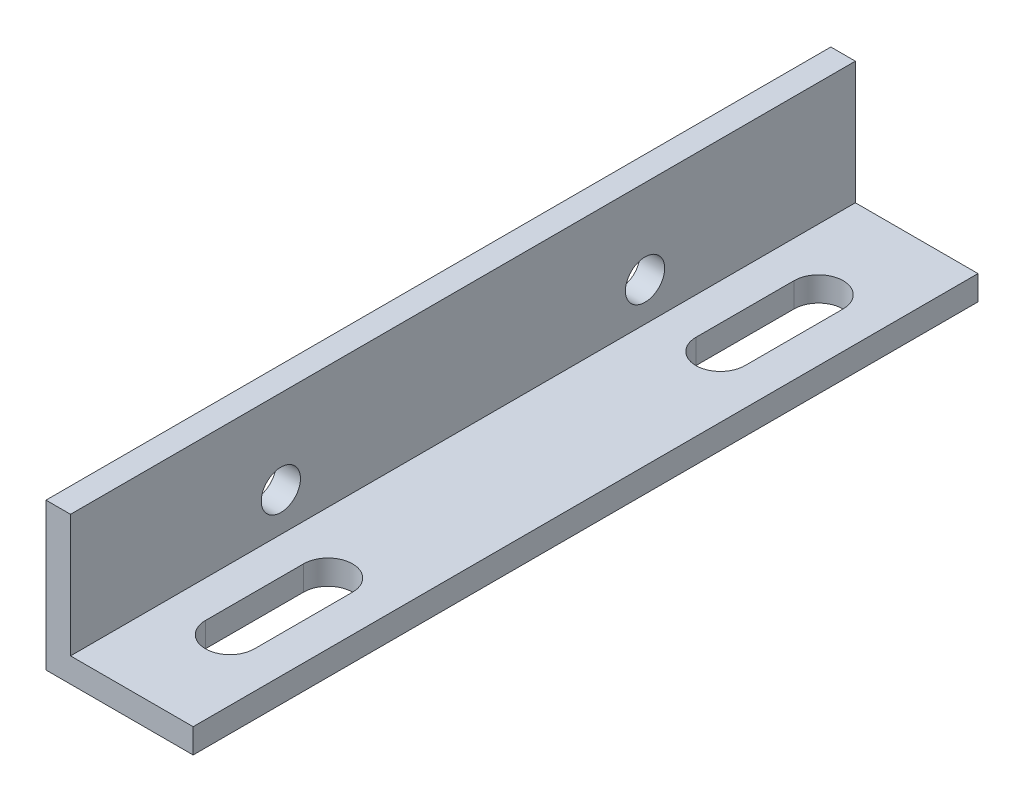
ISO-10303-21;
HEADER;
FILE_DESCRIPTION(('STEP AP214'),'2;1');
FILE_NAME('part.step','',(''),(''),'','','');
FILE_SCHEMA(('AUTOMOTIVE_DESIGN { 1 0 10303 214 1 1 1 1 }'));
ENDSEC;
DATA;
#1=APPLICATION_CONTEXT('core data for automotive mechanical design processes');
#2=APPLICATION_PROTOCOL_DEFINITION('international standard','automotive_design',2000,#1);
#3=PRODUCT_CONTEXT('',#1,'mechanical');
#4=PRODUCT('Part','Part','',(#3));
#5=PRODUCT_RELATED_PRODUCT_CATEGORY('part','',(#4));
#6=PRODUCT_DEFINITION_FORMATION('','',#4);
#7=PRODUCT_DEFINITION_CONTEXT('part definition',#1,'design');
#8=PRODUCT_DEFINITION('design','',#6,#7);
#9=PRODUCT_DEFINITION_SHAPE('','',#8);
#10=(LENGTH_UNIT() NAMED_UNIT(*) SI_UNIT(.MILLI.,.METRE.));
#11=(NAMED_UNIT(*) PLANE_ANGLE_UNIT() SI_UNIT($,.RADIAN.));
#12=(NAMED_UNIT(*) SI_UNIT($,.STERADIAN.) SOLID_ANGLE_UNIT());
#13=UNCERTAINTY_MEASURE_WITH_UNIT(LENGTH_MEASURE(1.E-05),#10,'distance_accuracy_value','');
#14=(GEOMETRIC_REPRESENTATION_CONTEXT(3) GLOBAL_UNCERTAINTY_ASSIGNED_CONTEXT((#13)) GLOBAL_UNIT_ASSIGNED_CONTEXT((#10,
#11,#12)) REPRESENTATION_CONTEXT('',''));
#15=CARTESIAN_POINT('',(0.,0.,0.));
#16=DIRECTION('',(0.,0.,1.));
#17=DIRECTION('',(1.,0.,0.));
#18=AXIS2_PLACEMENT_3D('',#15,#16,#17);
#19=CARTESIAN_POINT('',(24.638,31.75,53.9466685319904));
#20=DIRECTION('',(0.,-1.,0.));
#21=DIRECTION('',(0.,0.,-1.));
#22=AXIS2_PLACEMENT_3D('',#19,#20,#21);
#23=PLANE('',#22);
#24=DIRECTION('',(-1.,0.,0.));
#25=VECTOR('',#24,1.);
#26=CARTESIAN_POINT('',(24.638,31.75,-47.6533314680096));
#27=LINE('',#26,#25);
#28=CARTESIAN_POINT('',(24.638,31.75,-47.6533314680096));
#29=VERTEX_POINT('',#28);
#30=CARTESIAN_POINT('',(21.463,31.75,-47.6533314680096));
#31=VERTEX_POINT('',#30);
#32=EDGE_CURVE('E197',#29,#31,#27,.T.);
#33=ORIENTED_EDGE('',*,*,#32,.T.);
#34=DIRECTION('',(0.,0.,-1.));
#35=VECTOR('',#34,1.);
#36=CARTESIAN_POINT('',(21.463,31.75,53.9466685319904));
#37=LINE('',#36,#35);
#38=CARTESIAN_POINT('',(21.463,31.75,53.9466685319904));
#39=VERTEX_POINT('',#38);
#40=EDGE_CURVE('E11',#39,#31,#37,.T.);
#41=ORIENTED_EDGE('',*,*,#40,.F.);
#42=DIRECTION('',(-1.,0.,0.));
#43=VECTOR('',#42,1.);
#44=CARTESIAN_POINT('',(24.638,31.75,53.9466685319904));
#45=LINE('',#44,#43);
#46=CARTESIAN_POINT('',(24.638,31.75,53.9466685319904));
#47=VERTEX_POINT('',#46);
#48=EDGE_CURVE('E204',#47,#39,#45,.T.);
#49=ORIENTED_EDGE('',*,*,#48,.F.);
#50=DIRECTION('',(0.,0.,-1.));
#51=VECTOR('',#50,1.);
#52=CARTESIAN_POINT('',(24.638,31.75,53.9466685319904));
#53=LINE('',#52,#51);
#54=EDGE_CURVE('E218',#47,#29,#53,.T.);
#55=ORIENTED_EDGE('',*,*,#54,.T.);
#56=EDGE_LOOP('',(#33,#41,#49,#55));
#57=FACE_BOUND('',#56,.T.);
#58=ADVANCED_FACE('F31',(#57),#23,.F.);
#59=CARTESIAN_POINT('',(21.463,31.75,53.9466685319904));
#60=DIRECTION('',(1.,0.,0.));
#61=DIRECTION('',(0.,1.,0.));
#62=AXIS2_PLACEMENT_3D('',#59,#60,#61);
#63=PLANE('',#62);
#64=CARTESIAN_POINT('',(21.463,20.8788,26.7178685319904));
#65=DIRECTION('',(1.,0.,0.));
#66=DIRECTION('',(0.,0.,-1.));
#67=AXIS2_PLACEMENT_3D('',#64,#65,#66);
#68=CIRCLE('',#67,2.54);
#69=CARTESIAN_POINT('',(21.463,20.8788,24.1778685319904));
#70=VERTEX_POINT('',#69);
#71=EDGE_CURVE('E430',#70,#70,#68,.T.);
#72=ORIENTED_EDGE('',*,*,#71,.T.);
#73=EDGE_LOOP('',(#72));
#74=FACE_BOUND('',#73,.T.);
#75=CARTESIAN_POINT('',(21.463,20.8788,-20.4245314680097));
#76=DIRECTION('',(1.,0.,0.));
#77=DIRECTION('',(0.,0.,-1.));
#78=AXIS2_PLACEMENT_3D('',#75,#76,#77);
#79=CIRCLE('',#78,2.54);
#80=CARTESIAN_POINT('',(21.463,20.8788,-22.9645314680097));
#81=VERTEX_POINT('',#80);
#82=EDGE_CURVE('E162',#81,#81,#79,.T.);
#83=ORIENTED_EDGE('',*,*,#82,.T.);
#84=EDGE_LOOP('',(#83));
#85=FACE_BOUND('',#84,.T.);
#86=DIRECTION('',(0.,-1.,0.));
#87=VECTOR('',#86,1.);
#88=CARTESIAN_POINT('',(21.463,31.75,-47.6533314680096));
#89=LINE('',#88,#87);
#90=CARTESIAN_POINT('',(21.463,12.7,-47.6533314680096));
#91=VERTEX_POINT('',#90);
#92=EDGE_CURVE('E221',#31,#91,#89,.T.);
#93=ORIENTED_EDGE('',*,*,#92,.T.);
#94=DIRECTION('',(0.,0.,-1.));
#95=VECTOR('',#94,1.);
#96=CARTESIAN_POINT('',(21.463,12.7,53.9466685319904));
#97=LINE('',#96,#95);
#98=CARTESIAN_POINT('',(21.463,12.7,53.9466685319904));
#99=VERTEX_POINT('',#98);
#100=EDGE_CURVE('E38',#99,#91,#97,.T.);
#101=ORIENTED_EDGE('',*,*,#100,.F.);
#102=DIRECTION('',(0.,-1.,0.));
#103=VECTOR('',#102,1.);
#104=CARTESIAN_POINT('',(21.463,31.75,53.9466685319904));
#105=LINE('',#104,#103);
#106=EDGE_CURVE('E207',#39,#99,#105,.T.);
#107=ORIENTED_EDGE('',*,*,#106,.F.);
#108=ORIENTED_EDGE('',*,*,#40,.T.);
#109=EDGE_LOOP('',(#93,#101,#107,#108));
#110=FACE_BOUND('',#109,.T.);
#111=ADVANCED_FACE('F267',(#74,#85,#110),#63,.F.);
#112=CARTESIAN_POINT('',(21.463,12.7,53.9466685319904));
#113=DIRECTION('',(0.,1.,0.));
#114=DIRECTION('',(-1.,0.,0.));
#115=AXIS2_PLACEMENT_3D('',#112,#113,#114);
#116=PLANE('',#115);
#117=DIRECTION('',(0.,0.,-1.));
#118=VECTOR('',#117,1.);
#119=CARTESIAN_POINT('',(35.7505,12.7,-34.9533314680097));
#120=LINE('',#119,#118);
#121=CARTESIAN_POINT('',(35.7505,12.7,-22.2533314680096));
#122=VERTEX_POINT('',#121);
#123=CARTESIAN_POINT('',(35.7505,12.7,-34.9533314680097));
#124=VERTEX_POINT('',#123);
#125=EDGE_CURVE('E139',#122,#124,#120,.T.);
#126=ORIENTED_EDGE('',*,*,#125,.T.);
#127=CARTESIAN_POINT('',(32.5755,12.7,-34.9533314680097));
#128=DIRECTION('',(0.,1.,0.));
#129=DIRECTION('',(0.,0.,1.));
#130=AXIS2_PLACEMENT_3D('',#127,#128,#129);
#131=CIRCLE('',#130,3.175);
#132=CARTESIAN_POINT('',(29.4005,12.7,-34.9533314680097));
#133=VERTEX_POINT('',#132);
#134=EDGE_CURVE('E133',#124,#133,#131,.T.);
#135=ORIENTED_EDGE('',*,*,#134,.T.);
#136=DIRECTION('',(0.,0.,1.));
#137=VECTOR('',#136,1.);
#138=CARTESIAN_POINT('',(29.4005,12.7,-34.9533314680097));
#139=LINE('',#138,#137);
#140=CARTESIAN_POINT('',(29.4005,12.7,-22.2533314680096));
#141=VERTEX_POINT('',#140);
#142=EDGE_CURVE('E142',#133,#141,#139,.T.);
#143=ORIENTED_EDGE('',*,*,#142,.T.);
#144=CARTESIAN_POINT('',(32.5755,12.7,-22.2533314680096));
#145=DIRECTION('',(0.,1.,0.));
#146=DIRECTION('',(0.,0.,1.));
#147=AXIS2_PLACEMENT_3D('',#144,#145,#146);
#148=CIRCLE('',#147,3.175);
#149=EDGE_CURVE('E45',#141,#122,#148,.T.);
#150=ORIENTED_EDGE('',*,*,#149,.T.);
#151=EDGE_LOOP('',(#126,#135,#143,#150));
#152=FACE_BOUND('',#151,.T.);
#153=DIRECTION('',(0.,0.,-1.));
#154=VECTOR('',#153,1.);
#155=CARTESIAN_POINT('',(35.7505,12.7,41.2466685319904));
#156=LINE('',#155,#154);
#157=CARTESIAN_POINT('',(35.7505,12.7,41.2466685319904));
#158=VERTEX_POINT('',#157);
#159=CARTESIAN_POINT('',(35.7505,12.7,28.5466685319904));
#160=VERTEX_POINT('',#159);
#161=EDGE_CURVE('E182',#158,#160,#156,.T.);
#162=ORIENTED_EDGE('',*,*,#161,.T.);
#163=CARTESIAN_POINT('',(32.5755,12.7,28.5466685319904));
#164=DIRECTION('',(0.,1.,0.));
#165=DIRECTION('',(0.,0.,-1.));
#166=AXIS2_PLACEMENT_3D('',#163,#164,#165);
#167=CIRCLE('',#166,3.175);
#168=CARTESIAN_POINT('',(29.4005,12.7,28.5466685319904));
#169=VERTEX_POINT('',#168);
#170=EDGE_CURVE('E172',#160,#169,#167,.T.);
#171=ORIENTED_EDGE('',*,*,#170,.T.);
#172=DIRECTION('',(0.,0.,1.));
#173=VECTOR('',#172,1.);
#174=CARTESIAN_POINT('',(29.4005,12.7,41.2466685319904));
#175=LINE('',#174,#173);
#176=CARTESIAN_POINT('',(29.4005,12.7,41.2466685319904));
#177=VERTEX_POINT('',#176);
#178=EDGE_CURVE('E175',#169,#177,#175,.T.);
#179=ORIENTED_EDGE('',*,*,#178,.T.);
#180=CARTESIAN_POINT('',(32.5755,12.7,41.2466685319904));
#181=DIRECTION('',(0.,1.,0.));
#182=DIRECTION('',(0.,0.,-1.));
#183=AXIS2_PLACEMENT_3D('',#180,#181,#182);
#184=CIRCLE('',#183,3.175);
#185=EDGE_CURVE('E179',#177,#158,#184,.T.);
#186=ORIENTED_EDGE('',*,*,#185,.T.);
#187=EDGE_LOOP('',(#162,#171,#179,#186));
#188=FACE_BOUND('',#187,.T.);
#189=DIRECTION('',(1.,0.,0.));
#190=VECTOR('',#189,1.);
#191=CARTESIAN_POINT('',(21.463,12.7,-47.6533314680096));
#192=LINE('',#191,#190);
#193=CARTESIAN_POINT('',(40.513,12.7,-47.6533314680096));
#194=VERTEX_POINT('',#193);
#195=EDGE_CURVE('E223',#91,#194,#192,.T.);
#196=ORIENTED_EDGE('',*,*,#195,.T.);
#197=DIRECTION('',(0.,0.,-1.));
#198=VECTOR('',#197,1.);
#199=CARTESIAN_POINT('',(40.513,12.7,53.9466685319904));
#200=LINE('',#199,#198);
#201=CARTESIAN_POINT('',(40.513,12.7,53.9466685319904));
#202=VERTEX_POINT('',#201);
#203=EDGE_CURVE('E238',#202,#194,#200,.T.);
#204=ORIENTED_EDGE('',*,*,#203,.F.);
#205=DIRECTION('',(1.,0.,0.));
#206=VECTOR('',#205,1.);
#207=CARTESIAN_POINT('',(21.463,12.7,53.9466685319904));
#208=LINE('',#207,#206);
#209=EDGE_CURVE('E210',#99,#202,#208,.T.);
#210=ORIENTED_EDGE('',*,*,#209,.F.);
#211=ORIENTED_EDGE('',*,*,#100,.T.);
#212=EDGE_LOOP('',(#196,#204,#210,#211));
#213=FACE_BOUND('',#212,.T.);
#214=ADVANCED_FACE('F146',(#152,#188,#213),#116,.F.);
#215=CARTESIAN_POINT('',(40.513,12.7,53.9466685319904));
#216=DIRECTION('',(-1.,0.,0.));
#217=DIRECTION('',(0.,0.,1.));
#218=AXIS2_PLACEMENT_3D('',#215,#216,#217);
#219=PLANE('',#218);
#220=DIRECTION('',(0.,1.,0.));
#221=VECTOR('',#220,1.);
#222=CARTESIAN_POINT('',(40.513,12.7,-47.6533314680096));
#223=LINE('',#222,#221);
#224=CARTESIAN_POINT('',(40.513,15.875,-47.6533314680096));
#225=VERTEX_POINT('',#224);
#226=EDGE_CURVE('E225',#194,#225,#223,.T.);
#227=ORIENTED_EDGE('',*,*,#226,.T.);
#228=DIRECTION('',(0.,0.,-1.));
#229=VECTOR('',#228,1.);
#230=CARTESIAN_POINT('',(40.513,15.875,53.9466685319904));
#231=LINE('',#230,#229);
#232=CARTESIAN_POINT('',(40.513,15.875,53.9466685319904));
#233=VERTEX_POINT('',#232);
#234=EDGE_CURVE('E235',#233,#225,#231,.T.);
#235=ORIENTED_EDGE('',*,*,#234,.F.);
#236=DIRECTION('',(0.,1.,0.));
#237=VECTOR('',#236,1.);
#238=CARTESIAN_POINT('',(40.513,12.7,53.9466685319904));
#239=LINE('',#238,#237);
#240=EDGE_CURVE('E212',#202,#233,#239,.T.);
#241=ORIENTED_EDGE('',*,*,#240,.F.);
#242=ORIENTED_EDGE('',*,*,#203,.T.);
#243=EDGE_LOOP('',(#227,#235,#241,#242));
#244=FACE_BOUND('',#243,.T.);
#245=ADVANCED_FACE('F255',(#244),#219,.F.);
#246=CARTESIAN_POINT('',(40.513,15.875,53.9466685319904));
#247=DIRECTION('',(0.,-1.,0.));
#248=DIRECTION('',(1.,0.,0.));
#249=AXIS2_PLACEMENT_3D('',#246,#247,#248);
#250=PLANE('',#249);
#251=DIRECTION('',(0.,0.,1.));
#252=VECTOR('',#251,1.);
#253=CARTESIAN_POINT('',(29.4005,15.875,-34.9533314680097));
#254=LINE('',#253,#252);
#255=CARTESIAN_POINT('',(29.4005,15.875,-34.9533314680097));
#256=VERTEX_POINT('',#255);
#257=CARTESIAN_POINT('',(29.4005,15.875,-22.2533314680096));
#258=VERTEX_POINT('',#257);
#259=EDGE_CURVE('E161',#256,#258,#254,.T.);
#260=ORIENTED_EDGE('',*,*,#259,.F.);
#261=CARTESIAN_POINT('',(32.5755,15.875,-34.9533314680097));
#262=DIRECTION('',(0.,1.,0.));
#263=DIRECTION('',(0.,0.,1.));
#264=AXIS2_PLACEMENT_3D('',#261,#262,#263);
#265=CIRCLE('',#264,3.175);
#266=CARTESIAN_POINT('',(35.7505,15.875,-34.9533314680097));
#267=VERTEX_POINT('',#266);
#268=EDGE_CURVE('E53',#267,#256,#265,.T.);
#269=ORIENTED_EDGE('',*,*,#268,.F.);
#270=DIRECTION('',(0.,0.,-1.));
#271=VECTOR('',#270,1.);
#272=CARTESIAN_POINT('',(35.7505,15.875,-34.9533314680097));
#273=LINE('',#272,#271);
#274=CARTESIAN_POINT('',(35.7505,15.875,-22.2533314680096));
#275=VERTEX_POINT('',#274);
#276=EDGE_CURVE('E149',#275,#267,#273,.T.);
#277=ORIENTED_EDGE('',*,*,#276,.F.);
#278=CARTESIAN_POINT('',(32.5755,15.875,-22.2533314680096));
#279=DIRECTION('',(0.,1.,0.));
#280=DIRECTION('',(0.,0.,1.));
#281=AXIS2_PLACEMENT_3D('',#278,#279,#280);
#282=CIRCLE('',#281,3.175);
#283=EDGE_CURVE('E152',#258,#275,#282,.T.);
#284=ORIENTED_EDGE('',*,*,#283,.F.);
#285=EDGE_LOOP('',(#260,#269,#277,#284));
#286=FACE_BOUND('',#285,.T.);
#287=DIRECTION('',(0.,0.,1.));
#288=VECTOR('',#287,1.);
#289=CARTESIAN_POINT('',(29.4005,15.875,41.2466685319904));
#290=LINE('',#289,#288);
#291=CARTESIAN_POINT('',(29.4005,15.875,28.5466685319904));
#292=VERTEX_POINT('',#291);
#293=CARTESIAN_POINT('',(29.4005,15.875,41.2466685319904));
#294=VERTEX_POINT('',#293);
#295=EDGE_CURVE('E187',#292,#294,#290,.T.);
#296=ORIENTED_EDGE('',*,*,#295,.F.);
#297=CARTESIAN_POINT('',(32.5755,15.875,28.5466685319904));
#298=DIRECTION('',(0.,1.,0.));
#299=DIRECTION('',(0.,0.,-1.));
#300=AXIS2_PLACEMENT_3D('',#297,#298,#299);
#301=CIRCLE('',#300,3.175);
#302=CARTESIAN_POINT('',(35.7505,15.875,28.5466685319904));
#303=VERTEX_POINT('',#302);
#304=EDGE_CURVE('E168',#303,#292,#301,.T.);
#305=ORIENTED_EDGE('',*,*,#304,.F.);
#306=DIRECTION('',(0.,0.,-1.));
#307=VECTOR('',#306,1.);
#308=CARTESIAN_POINT('',(35.7505,15.875,41.2466685319904));
#309=LINE('',#308,#307);
#310=CARTESIAN_POINT('',(35.7505,15.875,41.2466685319904));
#311=VERTEX_POINT('',#310);
#312=EDGE_CURVE('E176',#311,#303,#309,.T.);
#313=ORIENTED_EDGE('',*,*,#312,.F.);
#314=CARTESIAN_POINT('',(32.5755,15.875,41.2466685319904));
#315=DIRECTION('',(0.,1.,0.));
#316=DIRECTION('',(0.,0.,-1.));
#317=AXIS2_PLACEMENT_3D('',#314,#315,#316);
#318=CIRCLE('',#317,3.175);
#319=EDGE_CURVE('E190',#294,#311,#318,.T.);
#320=ORIENTED_EDGE('',*,*,#319,.F.);
#321=EDGE_LOOP('',(#296,#305,#313,#320));
#322=FACE_BOUND('',#321,.T.);
#323=DIRECTION('',(-1.,0.,0.));
#324=VECTOR('',#323,1.);
#325=CARTESIAN_POINT('',(40.513,15.875,-47.6533314680096));
#326=LINE('',#325,#324);
#327=CARTESIAN_POINT('',(24.638,15.875,-47.6533314680096));
#328=VERTEX_POINT('',#327);
#329=EDGE_CURVE('E227',#225,#328,#326,.T.);
#330=ORIENTED_EDGE('',*,*,#329,.T.);
#331=DIRECTION('',(0.,0.,-1.));
#332=VECTOR('',#331,1.);
#333=CARTESIAN_POINT('',(24.638,15.875,53.9466685319904));
#334=LINE('',#333,#332);
#335=CARTESIAN_POINT('',(24.638,15.875,53.9466685319904));
#336=VERTEX_POINT('',#335);
#337=EDGE_CURVE('E232',#336,#328,#334,.T.);
#338=ORIENTED_EDGE('',*,*,#337,.F.);
#339=DIRECTION('',(-1.,0.,0.));
#340=VECTOR('',#339,1.);
#341=CARTESIAN_POINT('',(40.513,15.875,53.9466685319904));
#342=LINE('',#341,#340);
#343=EDGE_CURVE('E214',#233,#336,#342,.T.);
#344=ORIENTED_EDGE('',*,*,#343,.F.);
#345=ORIENTED_EDGE('',*,*,#234,.T.);
#346=EDGE_LOOP('',(#330,#338,#344,#345));
#347=FACE_BOUND('',#346,.T.);
#348=ADVANCED_FACE('F259',(#286,#322,#347),#250,.F.);
#349=CARTESIAN_POINT('',(24.638,15.875,53.9466685319904));
#350=DIRECTION('',(-1.,0.,0.));
#351=DIRECTION('',(0.,-1.,0.));
#352=AXIS2_PLACEMENT_3D('',#349,#350,#351);
#353=PLANE('',#352);
#354=CARTESIAN_POINT('',(24.638,20.8788,26.7178685319904));
#355=DIRECTION('',(1.,0.,0.));
#356=DIRECTION('',(0.,0.,-1.));
#357=AXIS2_PLACEMENT_3D('',#354,#355,#356);
#358=CIRCLE('',#357,2.54);
#359=CARTESIAN_POINT('',(24.638,20.8788,24.1778685319904));
#360=VERTEX_POINT('',#359);
#361=EDGE_CURVE('E432',#360,#360,#358,.T.);
#362=ORIENTED_EDGE('',*,*,#361,.F.);
#363=EDGE_LOOP('',(#362));
#364=FACE_BOUND('',#363,.T.);
#365=CARTESIAN_POINT('',(24.638,20.8788,-20.4245314680097));
#366=DIRECTION('',(1.,0.,0.));
#367=DIRECTION('',(0.,0.,-1.));
#368=AXIS2_PLACEMENT_3D('',#365,#366,#367);
#369=CIRCLE('',#368,2.54);
#370=CARTESIAN_POINT('',(24.638,20.8788,-22.9645314680097));
#371=VERTEX_POINT('',#370);
#372=EDGE_CURVE('E155',#371,#371,#369,.T.);
#373=ORIENTED_EDGE('',*,*,#372,.F.);
#374=EDGE_LOOP('',(#373));
#375=FACE_BOUND('',#374,.T.);
#376=DIRECTION('',(0.,1.,0.));
#377=VECTOR('',#376,1.);
#378=CARTESIAN_POINT('',(24.638,15.875,-47.6533314680096));
#379=LINE('',#378,#377);
#380=EDGE_CURVE('E208',#328,#29,#379,.T.);
#381=ORIENTED_EDGE('',*,*,#380,.T.);
#382=ORIENTED_EDGE('',*,*,#54,.F.);
#383=DIRECTION('',(0.,1.,0.));
#384=VECTOR('',#383,1.);
#385=CARTESIAN_POINT('',(24.638,15.875,53.9466685319904));
#386=LINE('',#385,#384);
#387=EDGE_CURVE('E216',#336,#47,#386,.T.);
#388=ORIENTED_EDGE('',*,*,#387,.F.);
#389=ORIENTED_EDGE('',*,*,#337,.T.);
#390=EDGE_LOOP('',(#381,#382,#388,#389));
#391=FACE_BOUND('',#390,.T.);
#392=ADVANCED_FACE('F270',(#364,#375,#391),#353,.F.);
#393=CARTESIAN_POINT('',(21.463,31.75,53.9466685319904));
#394=DIRECTION('',(0.,0.,1.));
#395=DIRECTION('',(1.,0.,0.));
#396=AXIS2_PLACEMENT_3D('',#393,#394,#395);
#397=PLANE('',#396);
#398=ORIENTED_EDGE('',*,*,#48,.T.);
#399=ORIENTED_EDGE('',*,*,#106,.T.);
#400=ORIENTED_EDGE('',*,*,#209,.T.);
#401=ORIENTED_EDGE('',*,*,#240,.T.);
#402=ORIENTED_EDGE('',*,*,#343,.T.);
#403=ORIENTED_EDGE('',*,*,#387,.T.);
#404=EDGE_LOOP('',(#398,#399,#400,#401,#402,#403));
#405=FACE_BOUND('',#404,.T.);
#406=ADVANCED_FACE('F263',(#405),#397,.T.);
#407=CARTESIAN_POINT('',(21.463,31.75,-47.6533314680096));
#408=DIRECTION('',(0.,0.,1.));
#409=DIRECTION('',(1.,0.,0.));
#410=AXIS2_PLACEMENT_3D('',#407,#408,#409);
#411=PLANE('',#410);
#412=ORIENTED_EDGE('',*,*,#32,.F.);
#413=ORIENTED_EDGE('',*,*,#380,.F.);
#414=ORIENTED_EDGE('',*,*,#329,.F.);
#415=ORIENTED_EDGE('',*,*,#226,.F.);
#416=ORIENTED_EDGE('',*,*,#195,.F.);
#417=ORIENTED_EDGE('',*,*,#92,.F.);
#418=EDGE_LOOP('',(#412,#413,#414,#415,#416,#417));
#419=FACE_BOUND('',#418,.T.);
#420=ADVANCED_FACE('F250',(#419),#411,.F.);
#421=CARTESIAN_POINT('',(32.5755,12.7,28.5466685319904));
#422=DIRECTION('',(0.,1.,0.));
#423=DIRECTION('',(0.,0.,1.));
#424=AXIS2_PLACEMENT_3D('',#421,#422,#423);
#425=CYLINDRICAL_SURFACE('',#424,3.175);
#426=ORIENTED_EDGE('',*,*,#304,.T.);
#427=DIRECTION('',(0.,1.,0.));
#428=VECTOR('',#427,1.);
#429=CARTESIAN_POINT('',(29.4005,12.7,28.5466685319904));
#430=LINE('',#429,#428);
#431=EDGE_CURVE('E185',#169,#292,#430,.T.);
#432=ORIENTED_EDGE('',*,*,#431,.F.);
#433=ORIENTED_EDGE('',*,*,#170,.F.);
#434=DIRECTION('',(0.,1.,0.));
#435=VECTOR('',#434,1.);
#436=CARTESIAN_POINT('',(35.7505,12.7,28.5466685319904));
#437=LINE('',#436,#435);
#438=EDGE_CURVE('E195',#160,#303,#437,.T.);
#439=ORIENTED_EDGE('',*,*,#438,.T.);
#440=EDGE_LOOP('',(#426,#432,#433,#439));
#441=FACE_BOUND('',#440,.T.);
#442=ADVANCED_FACE('F315',(#441),#425,.F.);
#443=CARTESIAN_POINT('',(35.7505,12.7,41.2466685319904));
#444=DIRECTION('',(1.,0.,0.));
#445=DIRECTION('',(0.,0.,-1.));
#446=AXIS2_PLACEMENT_3D('',#443,#444,#445);
#447=PLANE('',#446);
#448=ORIENTED_EDGE('',*,*,#312,.T.);
#449=ORIENTED_EDGE('',*,*,#438,.F.);
#450=ORIENTED_EDGE('',*,*,#161,.F.);
#451=DIRECTION('',(0.,1.,0.));
#452=VECTOR('',#451,1.);
#453=CARTESIAN_POINT('',(35.7505,12.7,41.2466685319904));
#454=LINE('',#453,#452);
#455=EDGE_CURVE('E198',#158,#311,#454,.T.);
#456=ORIENTED_EDGE('',*,*,#455,.T.);
#457=EDGE_LOOP('',(#448,#449,#450,#456));
#458=FACE_BOUND('',#457,.T.);
#459=ADVANCED_FACE('F320',(#458),#447,.F.);
#460=CARTESIAN_POINT('',(32.5755,12.7,41.2466685319904));
#461=DIRECTION('',(0.,1.,0.));
#462=DIRECTION('',(0.,0.,1.));
#463=AXIS2_PLACEMENT_3D('',#460,#461,#462);
#464=CYLINDRICAL_SURFACE('',#463,3.175);
#465=ORIENTED_EDGE('',*,*,#319,.T.);
#466=ORIENTED_EDGE('',*,*,#455,.F.);
#467=ORIENTED_EDGE('',*,*,#185,.F.);
#468=DIRECTION('',(0.,1.,0.));
#469=VECTOR('',#468,1.);
#470=CARTESIAN_POINT('',(29.4005,12.7,41.2466685319904));
#471=LINE('',#470,#469);
#472=EDGE_CURVE('E200',#177,#294,#471,.T.);
#473=ORIENTED_EDGE('',*,*,#472,.T.);
#474=EDGE_LOOP('',(#465,#466,#467,#473));
#475=FACE_BOUND('',#474,.T.);
#476=ADVANCED_FACE('F332',(#475),#464,.F.);
#477=CARTESIAN_POINT('',(29.4005,12.7,41.2466685319904));
#478=DIRECTION('',(-1.,0.,0.));
#479=DIRECTION('',(0.,0.,1.));
#480=AXIS2_PLACEMENT_3D('',#477,#478,#479);
#481=PLANE('',#480);
#482=ORIENTED_EDGE('',*,*,#295,.T.);
#483=ORIENTED_EDGE('',*,*,#472,.F.);
#484=ORIENTED_EDGE('',*,*,#178,.F.);
#485=ORIENTED_EDGE('',*,*,#431,.T.);
#486=EDGE_LOOP('',(#482,#483,#484,#485));
#487=FACE_BOUND('',#486,.T.);
#488=ADVANCED_FACE('F342',(#487),#481,.F.);
#489=CARTESIAN_POINT('',(32.5755,12.7,-34.9533314680097));
#490=DIRECTION('',(0.,1.,0.));
#491=DIRECTION('',(0.,0.,1.));
#492=AXIS2_PLACEMENT_3D('',#489,#490,#491);
#493=CYLINDRICAL_SURFACE('',#492,3.175);
#494=ORIENTED_EDGE('',*,*,#268,.T.);
#495=DIRECTION('',(0.,1.,0.));
#496=VECTOR('',#495,1.);
#497=CARTESIAN_POINT('',(29.4005,12.7,-34.9533314680097));
#498=LINE('',#497,#496);
#499=EDGE_CURVE('E129',#133,#256,#498,.T.);
#500=ORIENTED_EDGE('',*,*,#499,.F.);
#501=ORIENTED_EDGE('',*,*,#134,.F.);
#502=DIRECTION('',(0.,1.,0.));
#503=VECTOR('',#502,1.);
#504=CARTESIAN_POINT('',(35.7505,12.7,-34.9533314680097));
#505=LINE('',#504,#503);
#506=EDGE_CURVE('E166',#124,#267,#505,.T.);
#507=ORIENTED_EDGE('',*,*,#506,.T.);
#508=EDGE_LOOP('',(#494,#500,#501,#507));
#509=FACE_BOUND('',#508,.T.);
#510=ADVANCED_FACE('F131',(#509),#493,.F.);
#511=CARTESIAN_POINT('',(35.7505,12.7,-34.9533314680097));
#512=DIRECTION('',(1.,0.,0.));
#513=DIRECTION('',(0.,0.,-1.));
#514=AXIS2_PLACEMENT_3D('',#511,#512,#513);
#515=PLANE('',#514);
#516=ORIENTED_EDGE('',*,*,#276,.T.);
#517=ORIENTED_EDGE('',*,*,#506,.F.);
#518=ORIENTED_EDGE('',*,*,#125,.F.);
#519=DIRECTION('',(0.,1.,0.));
#520=VECTOR('',#519,1.);
#521=CARTESIAN_POINT('',(35.7505,12.7,-22.2533314680096));
#522=LINE('',#521,#520);
#523=EDGE_CURVE('E169',#122,#275,#522,.T.);
#524=ORIENTED_EDGE('',*,*,#523,.T.);
#525=EDGE_LOOP('',(#516,#517,#518,#524));
#526=FACE_BOUND('',#525,.T.);
#527=ADVANCED_FACE('F361',(#526),#515,.F.);
#528=CARTESIAN_POINT('',(32.5755,12.7,-22.2533314680096));
#529=DIRECTION('',(0.,1.,0.));
#530=DIRECTION('',(0.,0.,1.));
#531=AXIS2_PLACEMENT_3D('',#528,#529,#530);
#532=CYLINDRICAL_SURFACE('',#531,3.175);
#533=ORIENTED_EDGE('',*,*,#283,.T.);
#534=ORIENTED_EDGE('',*,*,#523,.F.);
#535=ORIENTED_EDGE('',*,*,#149,.F.);
#536=DIRECTION('',(0.,1.,0.));
#537=VECTOR('',#536,1.);
#538=CARTESIAN_POINT('',(29.4005,12.7,-22.2533314680096));
#539=LINE('',#538,#537);
#540=EDGE_CURVE('E138',#141,#258,#539,.T.);
#541=ORIENTED_EDGE('',*,*,#540,.T.);
#542=EDGE_LOOP('',(#533,#534,#535,#541));
#543=FACE_BOUND('',#542,.T.);
#544=ADVANCED_FACE('F370',(#543),#532,.F.);
#545=CARTESIAN_POINT('',(29.4005,12.7,-34.9533314680097));
#546=DIRECTION('',(-1.,0.,0.));
#547=DIRECTION('',(0.,0.,1.));
#548=AXIS2_PLACEMENT_3D('',#545,#546,#547);
#549=PLANE('',#548);
#550=ORIENTED_EDGE('',*,*,#259,.T.);
#551=ORIENTED_EDGE('',*,*,#540,.F.);
#552=ORIENTED_EDGE('',*,*,#142,.F.);
#553=ORIENTED_EDGE('',*,*,#499,.T.);
#554=EDGE_LOOP('',(#550,#551,#552,#553));
#555=FACE_BOUND('',#554,.T.);
#556=ADVANCED_FACE('F143',(#555),#549,.F.);
#557=CARTESIAN_POINT('',(21.463,20.8788,-20.4245314680097));
#558=DIRECTION('',(1.,0.,0.));
#559=DIRECTION('',(0.,0.,-1.));
#560=AXIS2_PLACEMENT_3D('',#557,#558,#559);
#561=CYLINDRICAL_SURFACE('',#560,2.54);
#562=ORIENTED_EDGE('',*,*,#82,.F.);
#563=EDGE_LOOP('',(#562));
#564=FACE_BOUND('',#563,.T.);
#565=ORIENTED_EDGE('',*,*,#372,.T.);
#566=EDGE_LOOP('',(#565));
#567=FACE_BOUND('',#566,.T.);
#568=ADVANCED_FACE('F387',(#564,#567),#561,.F.);
#569=CARTESIAN_POINT('',(21.463,20.8788,26.7178685319904));
#570=DIRECTION('',(1.,0.,0.));
#571=DIRECTION('',(0.,0.,-1.));
#572=AXIS2_PLACEMENT_3D('',#569,#570,#571);
#573=CYLINDRICAL_SURFACE('',#572,2.54);
#574=ORIENTED_EDGE('',*,*,#71,.F.);
#575=EDGE_LOOP('',(#574));
#576=FACE_BOUND('',#575,.T.);
#577=ORIENTED_EDGE('',*,*,#361,.T.);
#578=EDGE_LOOP('',(#577));
#579=FACE_BOUND('',#578,.T.);
#580=ADVANCED_FACE('F406',(#576,#579),#573,.F.);
#581=CLOSED_SHELL('',(#58,#111,#214,#245,#348,#392,#406,#420,#442,#459,#476,#488,#510,#527,#544,
#556,#568,#580));
#582=MANIFOLD_SOLID_BREP('B2',#581);
#583=ADVANCED_BREP_SHAPE_REPRESENTATION('',(#18,#582),#14);
#584=SHAPE_DEFINITION_REPRESENTATION(#9,#583);
ENDSEC;
END-ISO-10303-21;
